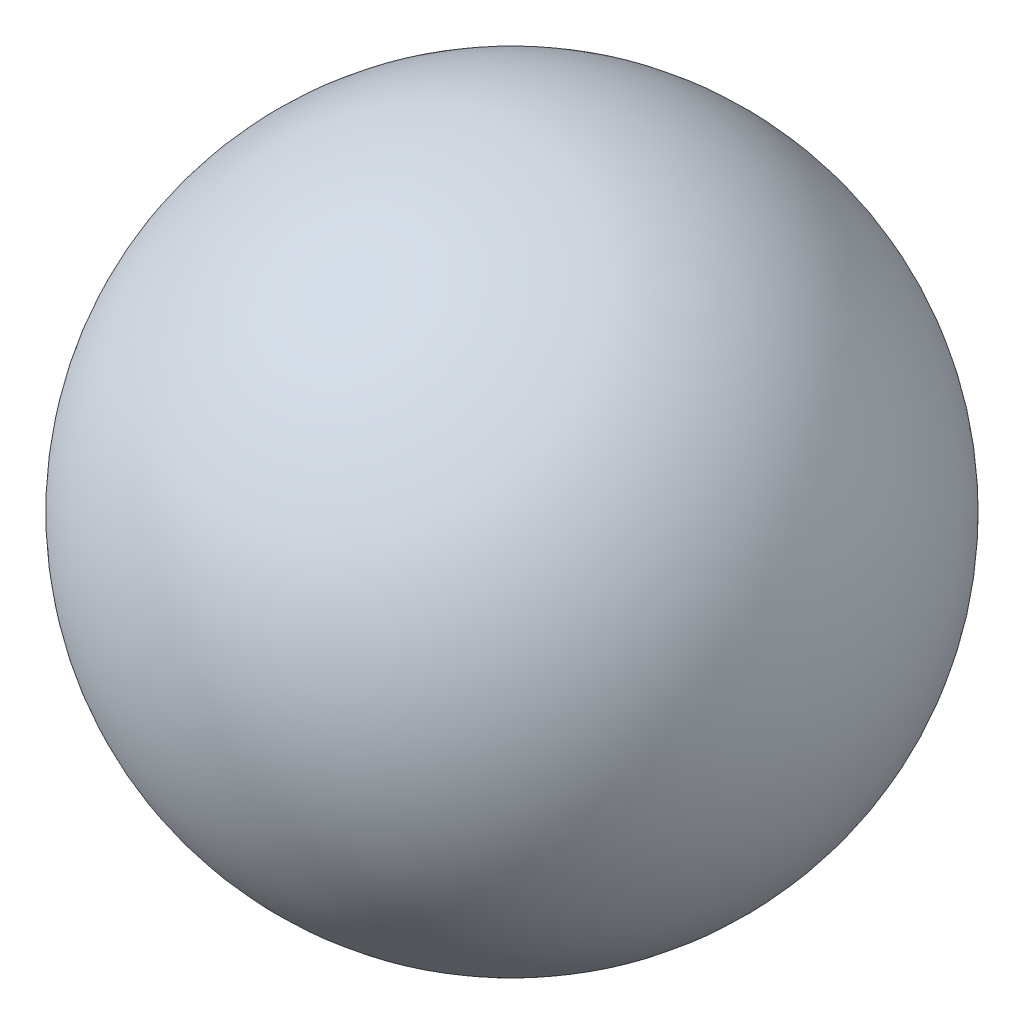
ISO-10303-21;
HEADER;
FILE_DESCRIPTION(('STEP AP214'),'2;1');
FILE_NAME('part.step','',(''),(''),'','','');
FILE_SCHEMA(('AUTOMOTIVE_DESIGN { 1 0 10303 214 1 1 1 1 }'));
ENDSEC;
DATA;
#1=APPLICATION_CONTEXT('core data for automotive mechanical design processes');
#2=APPLICATION_PROTOCOL_DEFINITION('international standard','automotive_design',2000,#1);
#3=PRODUCT_CONTEXT('',#1,'mechanical');
#4=PRODUCT('Part','Part','',(#3));
#5=PRODUCT_RELATED_PRODUCT_CATEGORY('part','',(#4));
#6=PRODUCT_DEFINITION_FORMATION('','',#4);
#7=PRODUCT_DEFINITION_CONTEXT('part definition',#1,'design');
#8=PRODUCT_DEFINITION('design','',#6,#7);
#9=PRODUCT_DEFINITION_SHAPE('','',#8);
#10=(LENGTH_UNIT() NAMED_UNIT(*) SI_UNIT(.MILLI.,.METRE.));
#11=(NAMED_UNIT(*) PLANE_ANGLE_UNIT() SI_UNIT($,.RADIAN.));
#12=(NAMED_UNIT(*) SI_UNIT($,.STERADIAN.) SOLID_ANGLE_UNIT());
#13=UNCERTAINTY_MEASURE_WITH_UNIT(LENGTH_MEASURE(1.E-05),#10,'distance_accuracy_value','');
#14=(GEOMETRIC_REPRESENTATION_CONTEXT(3) GLOBAL_UNCERTAINTY_ASSIGNED_CONTEXT((#13)) GLOBAL_UNIT_ASSIGNED_CONTEXT((#10,
#11,#12)) REPRESENTATION_CONTEXT('',''));
#15=CARTESIAN_POINT('',(0.,0.,0.));
#16=DIRECTION('',(0.,0.,1.));
#17=DIRECTION('',(1.,0.,0.));
#18=AXIS2_PLACEMENT_3D('',#15,#16,#17);
#19=CARTESIAN_POINT('',(0.,0.,0.));
#20=DIRECTION('',(0.,1.,0.));
#21=DIRECTION('',(0.,0.,-1.));
#22=AXIS2_PLACEMENT_3D('',#19,#20,#21);
#23=SPHERICAL_SURFACE('',#22,6.35);
#24=CARTESIAN_POINT('',(0.,6.35,0.));
#25=VERTEX_POINT('',#24);
#26=VERTEX_LOOP('',#25);
#27=FACE_BOUND('',#26,.T.);
#28=ADVANCED_FACE('F35',(#27),#23,.T.);
#29=CLOSED_SHELL('',(#28));
#30=MANIFOLD_SOLID_BREP('B2',#29);
#31=ADVANCED_BREP_SHAPE_REPRESENTATION('',(#18,#30),#14);
#32=SHAPE_DEFINITION_REPRESENTATION(#9,#31);
ENDSEC;
END-ISO-10303-21;
